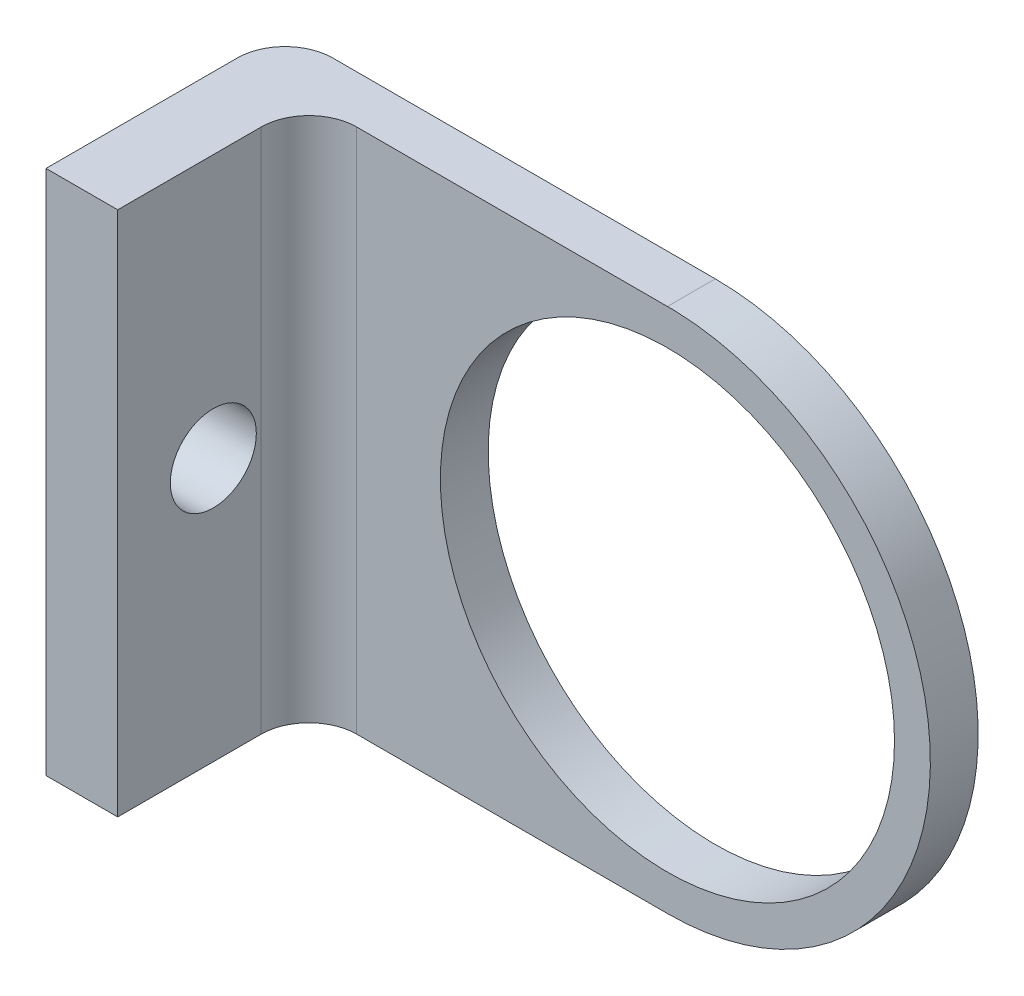
ISO-10303-21;
HEADER;
FILE_DESCRIPTION(('STEP AP214'),'2;1');
FILE_NAME('part.step','',(''),(''),'','','');
FILE_SCHEMA(('AUTOMOTIVE_DESIGN { 1 0 10303 214 1 1 1 1 }'));
ENDSEC;
DATA;
#1=APPLICATION_CONTEXT('core data for automotive mechanical design processes');
#2=APPLICATION_PROTOCOL_DEFINITION('international standard','automotive_design',2000,#1);
#3=PRODUCT_CONTEXT('',#1,'mechanical');
#4=PRODUCT('Part','Part','',(#3));
#5=PRODUCT_RELATED_PRODUCT_CATEGORY('part','',(#4));
#6=PRODUCT_DEFINITION_FORMATION('','',#4);
#7=PRODUCT_DEFINITION_CONTEXT('part definition',#1,'design');
#8=PRODUCT_DEFINITION('design','',#6,#7);
#9=PRODUCT_DEFINITION_SHAPE('','',#8);
#10=(LENGTH_UNIT() NAMED_UNIT(*) SI_UNIT(.MILLI.,.METRE.));
#11=(NAMED_UNIT(*) PLANE_ANGLE_UNIT() SI_UNIT($,.RADIAN.));
#12=(NAMED_UNIT(*) SI_UNIT($,.STERADIAN.) SOLID_ANGLE_UNIT());
#13=UNCERTAINTY_MEASURE_WITH_UNIT(LENGTH_MEASURE(1.E-05),#10,'distance_accuracy_value','');
#14=(GEOMETRIC_REPRESENTATION_CONTEXT(3) GLOBAL_UNCERTAINTY_ASSIGNED_CONTEXT((#13)) GLOBAL_UNIT_ASSIGNED_CONTEXT((#10,
#11,#12)) REPRESENTATION_CONTEXT('',''));
#15=CARTESIAN_POINT('',(0.,0.,0.));
#16=DIRECTION('',(0.,0.,1.));
#17=DIRECTION('',(1.,0.,0.));
#18=AXIS2_PLACEMENT_3D('',#15,#16,#17);
#19=CARTESIAN_POINT('',(0.,0.,10.));
#20=DIRECTION('',(0.,0.,-1.));
#21=DIRECTION('',(-1.,0.,0.));
#22=AXIS2_PLACEMENT_3D('',#19,#20,#21);
#23=CYLINDRICAL_SURFACE('',#22,11.);
#24=CARTESIAN_POINT('',(0.,0.,2.));
#25=DIRECTION('',(0.,0.,1.));
#26=DIRECTION('',(1.,0.,0.));
#27=AXIS2_PLACEMENT_3D('',#24,#25,#26);
#28=CIRCLE('',#27,11.);
#29=CARTESIAN_POINT('',(0.,-11.,2.));
#30=VERTEX_POINT('',#29);
#31=CARTESIAN_POINT('',(0.386602839668812,10.9932041846024,2.));
#32=VERTEX_POINT('',#31);
#33=EDGE_CURVE('E109',#30,#32,#28,.T.);
#34=ORIENTED_EDGE('',*,*,#33,.F.);
#35=DIRECTION('',(0.,0.,-1.));
#36=VECTOR('',#35,1.);
#37=CARTESIAN_POINT('',(0.,-11.,10.));
#38=LINE('',#37,#36);
#39=CARTESIAN_POINT('',(0.,-11.,0.));
#40=VERTEX_POINT('',#39);
#41=EDGE_CURVE('E119',#30,#40,#38,.T.);
#42=ORIENTED_EDGE('',*,*,#41,.T.);
#43=CARTESIAN_POINT('',(0.,0.,0.));
#44=DIRECTION('',(0.,0.,1.));
#45=DIRECTION('',(1.,0.,0.));
#46=AXIS2_PLACEMENT_3D('',#43,#44,#45);
#47=CIRCLE('',#46,11.);
#48=CARTESIAN_POINT('',(0.,11.,0.));
#49=VERTEX_POINT('',#48);
#50=EDGE_CURVE('E216',#40,#49,#47,.T.);
#51=ORIENTED_EDGE('',*,*,#50,.T.);
#52=DIRECTION('',(0.,0.,-1.));
#53=VECTOR('',#52,1.);
#54=CARTESIAN_POINT('',(0.,11.,10.));
#55=LINE('',#54,#53);
#56=CARTESIAN_POINT('',(-3.91820590765716E-06,10.9967174618641,2.));
#57=VERTEX_POINT('',#56);
#58=EDGE_CURVE('E139',#57,#49,#55,.T.);
#59=ORIENTED_EDGE('',*,*,#58,.F.);
#60=CARTESIAN_POINT('',(0.,0.,2.));
#61=DIRECTION('',(0.,0.,-1.));
#62=DIRECTION('',(-3.56413316921096E-07,0.999999999999936,0.));
#63=AXIS2_PLACEMENT_3D('',#60,#61,#62);
#64=CIRCLE('',#63,11.);
#65=EDGE_CURVE('E121',#57,#32,#64,.T.);
#66=ORIENTED_EDGE('',*,*,#65,.T.);
#67=EDGE_LOOP('',(#34,#42,#51,#59,#66));
#68=FACE_BOUND('',#67,.T.);
#69=ADVANCED_FACE('F41',(#68),#23,.T.);
#70=CARTESIAN_POINT('',(0.,11.,10.));
#71=DIRECTION('',(0.,-1.,0.));
#72=DIRECTION('',(0.,0.,-1.));
#73=AXIS2_PLACEMENT_3D('',#70,#71,#72);
#74=PLANE('',#73);
#75=DIRECTION('',(-1.,0.,0.));
#76=VECTOR('',#75,1.);
#77=CARTESIAN_POINT('',(0.,11.,0.));
#78=LINE('',#77,#76);
#79=CARTESIAN_POINT('',(-16.,11.,0.));
#80=VERTEX_POINT('',#79);
#81=EDGE_CURVE('E220',#49,#80,#78,.T.);
#82=ORIENTED_EDGE('',*,*,#81,.T.);
#83=CARTESIAN_POINT('',(-16.,11.,2.));
#84=DIRECTION('',(0.,-1.,0.));
#85=DIRECTION('',(0.,0.,-1.));
#86=AXIS2_PLACEMENT_3D('',#83,#84,#85);
#87=CIRCLE('',#86,2.);
#88=CARTESIAN_POINT('',(-18.,11.,2.));
#89=VERTEX_POINT('',#88);
#90=EDGE_CURVE('E159',#80,#89,#87,.F.);
#91=ORIENTED_EDGE('',*,*,#90,.T.);
#92=DIRECTION('',(0.,0.,-1.));
#93=VECTOR('',#92,1.);
#94=CARTESIAN_POINT('',(-18.,11.,10.));
#95=LINE('',#94,#93);
#96=CARTESIAN_POINT('',(-18.,11.,10.));
#97=VERTEX_POINT('',#96);
#98=EDGE_CURVE('E132',#97,#89,#95,.T.);
#99=ORIENTED_EDGE('',*,*,#98,.F.);
#100=DIRECTION('',(1.,0.,0.));
#101=VECTOR('',#100,1.);
#102=CARTESIAN_POINT('',(0.,11.,10.));
#103=LINE('',#102,#101);
#104=CARTESIAN_POINT('',(-15.,11.,10.));
#105=VERTEX_POINT('',#104);
#106=EDGE_CURVE('E147',#105,#97,#103,.F.);
#107=ORIENTED_EDGE('',*,*,#106,.F.);
#108=DIRECTION('',(0.,0.,1.));
#109=VECTOR('',#108,1.);
#110=CARTESIAN_POINT('',(-15.,11.,2.));
#111=LINE('',#110,#109);
#112=CARTESIAN_POINT('',(-15.,11.,4.));
#113=VERTEX_POINT('',#112);
#114=EDGE_CURVE('E178',#113,#105,#111,.T.);
#115=ORIENTED_EDGE('',*,*,#114,.F.);
#116=CARTESIAN_POINT('',(-13.,11.,4.));
#117=DIRECTION('',(0.,-1.,0.));
#118=DIRECTION('',(0.,0.,-1.));
#119=AXIS2_PLACEMENT_3D('',#116,#117,#118);
#120=CIRCLE('',#119,2.);
#121=CARTESIAN_POINT('',(-13.,11.,2.));
#122=VERTEX_POINT('',#121);
#123=EDGE_CURVE('E11',#113,#122,#120,.T.);
#124=ORIENTED_EDGE('',*,*,#123,.T.);
#125=DIRECTION('',(-1.,0.,0.));
#126=VECTOR('',#125,1.);
#127=CARTESIAN_POINT('',(0.,11.,2.));
#128=LINE('',#127,#126);
#129=EDGE_CURVE('E184',#57,#122,#128,.T.);
#130=ORIENTED_EDGE('',*,*,#129,.F.);
#131=ORIENTED_EDGE('',*,*,#58,.T.);
#132=EDGE_LOOP('',(#82,#91,#99,#107,#115,#124,#130,#131));
#133=FACE_BOUND('',#132,.T.);
#134=ADVANCED_FACE('F181',(#133),#74,.F.);
#135=CARTESIAN_POINT('',(0.,-11.,10.));
#136=DIRECTION('',(0.,-1.,0.));
#137=DIRECTION('',(0.,0.,-1.));
#138=AXIS2_PLACEMENT_3D('',#135,#136,#137);
#139=PLANE('',#138);
#140=DIRECTION('',(0.,0.,-1.));
#141=VECTOR('',#140,1.);
#142=CARTESIAN_POINT('',(-18.,-11.,10.));
#143=LINE('',#142,#141);
#144=CARTESIAN_POINT('',(-18.,-11.,10.));
#145=VERTEX_POINT('',#144);
#146=CARTESIAN_POINT('',(-18.,-11.,2.));
#147=VERTEX_POINT('',#146);
#148=EDGE_CURVE('E129',#145,#147,#143,.T.);
#149=ORIENTED_EDGE('',*,*,#148,.T.);
#150=CARTESIAN_POINT('',(-16.,-11.,2.));
#151=DIRECTION('',(0.,-1.,0.));
#152=DIRECTION('',(0.,0.,-1.));
#153=AXIS2_PLACEMENT_3D('',#150,#151,#152);
#154=CIRCLE('',#153,2.);
#155=CARTESIAN_POINT('',(-16.,-11.,0.));
#156=VERTEX_POINT('',#155);
#157=EDGE_CURVE('E168',#147,#156,#154,.T.);
#158=ORIENTED_EDGE('',*,*,#157,.T.);
#159=DIRECTION('',(-1.,0.,0.));
#160=VECTOR('',#159,1.);
#161=CARTESIAN_POINT('',(0.,-11.,0.));
#162=LINE('',#161,#160);
#163=EDGE_CURVE('E126',#40,#156,#162,.T.);
#164=ORIENTED_EDGE('',*,*,#163,.F.);
#165=ORIENTED_EDGE('',*,*,#41,.F.);
#166=DIRECTION('',(1.,0.,0.));
#167=VECTOR('',#166,1.);
#168=CARTESIAN_POINT('',(0.,-11.,2.));
#169=LINE('',#168,#167);
#170=CARTESIAN_POINT('',(-13.,-11.,2.));
#171=VERTEX_POINT('',#170);
#172=EDGE_CURVE('E104',#171,#30,#169,.T.);
#173=ORIENTED_EDGE('',*,*,#172,.F.);
#174=CARTESIAN_POINT('',(-13.,-11.,4.));
#175=DIRECTION('',(0.,-1.,0.));
#176=DIRECTION('',(0.,0.,-1.));
#177=AXIS2_PLACEMENT_3D('',#174,#175,#176);
#178=CIRCLE('',#177,2.);
#179=CARTESIAN_POINT('',(-15.,-11.,4.));
#180=VERTEX_POINT('',#179);
#181=EDGE_CURVE('E47',#171,#180,#178,.F.);
#182=ORIENTED_EDGE('',*,*,#181,.T.);
#183=DIRECTION('',(0.,0.,1.));
#184=VECTOR('',#183,1.);
#185=CARTESIAN_POINT('',(-15.,-11.,2.));
#186=LINE('',#185,#184);
#187=CARTESIAN_POINT('',(-15.,-11.,10.));
#188=VERTEX_POINT('',#187);
#189=EDGE_CURVE('E179',#180,#188,#186,.T.);
#190=ORIENTED_EDGE('',*,*,#189,.T.);
#191=DIRECTION('',(-1.,0.,0.));
#192=VECTOR('',#191,1.);
#193=CARTESIAN_POINT('',(0.,-11.,10.));
#194=LINE('',#193,#192);
#195=EDGE_CURVE('E128',#188,#145,#194,.T.);
#196=ORIENTED_EDGE('',*,*,#195,.T.);
#197=EDGE_LOOP('',(#149,#158,#164,#165,#173,#182,#190,#196));
#198=FACE_BOUND('',#197,.T.);
#199=ADVANCED_FACE('F127',(#198),#139,.T.);
#200=CARTESIAN_POINT('',(0.,0.,10.));
#201=DIRECTION('',(0.,0.,-1.));
#202=DIRECTION('',(-1.,0.,0.));
#203=AXIS2_PLACEMENT_3D('',#200,#201,#202);
#204=CYLINDRICAL_SURFACE('',#203,9.5);
#205=CARTESIAN_POINT('',(0.,0.,0.));
#206=DIRECTION('',(0.,0.,1.));
#207=DIRECTION('',(1.,0.,0.));
#208=AXIS2_PLACEMENT_3D('',#205,#206,#207);
#209=CIRCLE('',#208,9.5);
#210=CARTESIAN_POINT('',(9.5,0.,0.));
#211=VERTEX_POINT('',#210);
#212=EDGE_CURVE('E222',#211,#211,#209,.T.);
#213=ORIENTED_EDGE('',*,*,#212,.F.);
#214=EDGE_LOOP('',(#213));
#215=FACE_BOUND('',#214,.T.);
#216=CARTESIAN_POINT('',(0.,0.,2.));
#217=DIRECTION('',(0.,0.,1.));
#218=DIRECTION('',(1.,0.,0.));
#219=AXIS2_PLACEMENT_3D('',#216,#217,#218);
#220=CIRCLE('',#219,9.5);
#221=CARTESIAN_POINT('',(9.5,0.,2.));
#222=VERTEX_POINT('',#221);
#223=EDGE_CURVE('E137',#222,#222,#220,.T.);
#224=ORIENTED_EDGE('',*,*,#223,.T.);
#225=EDGE_LOOP('',(#224));
#226=FACE_BOUND('',#225,.T.);
#227=ADVANCED_FACE('F259',(#215,#226),#204,.F.);
#228=CARTESIAN_POINT('',(-18.,0.,10.));
#229=DIRECTION('',(-1.,0.,0.));
#230=DIRECTION('',(0.,0.,1.));
#231=AXIS2_PLACEMENT_3D('',#228,#229,#230);
#232=PLANE('',#231);
#233=CARTESIAN_POINT('',(-18.,-0.00169895384939667,6.));
#234=DIRECTION('',(-1.,0.,0.));
#235=DIRECTION('',(0.,0.,1.));
#236=AXIS2_PLACEMENT_3D('',#233,#234,#235);
#237=CIRCLE('',#236,1.8);
#238=CARTESIAN_POINT('',(-18.,-0.00169895384939667,7.8));
#239=VERTEX_POINT('',#238);
#240=EDGE_CURVE('E233',#239,#239,#237,.T.);
#241=ORIENTED_EDGE('',*,*,#240,.F.);
#242=EDGE_LOOP('',(#241));
#243=FACE_BOUND('',#242,.T.);
#244=ORIENTED_EDGE('',*,*,#98,.T.);
#245=DIRECTION('',(0.,1.,0.));
#246=VECTOR('',#245,1.);
#247=CARTESIAN_POINT('',(-18.,-11.,2.));
#248=LINE('',#247,#246);
#249=EDGE_CURVE('E163',#89,#147,#248,.F.);
#250=ORIENTED_EDGE('',*,*,#249,.T.);
#251=ORIENTED_EDGE('',*,*,#148,.F.);
#252=DIRECTION('',(0.,1.,0.));
#253=VECTOR('',#252,1.);
#254=CARTESIAN_POINT('',(-18.,0.,10.));
#255=LINE('',#254,#253);
#256=EDGE_CURVE('E133',#145,#97,#255,.T.);
#257=ORIENTED_EDGE('',*,*,#256,.T.);
#258=EDGE_LOOP('',(#244,#250,#251,#257));
#259=FACE_BOUND('',#258,.T.);
#260=ADVANCED_FACE('F230',(#243,#259),#232,.T.);
#261=CARTESIAN_POINT('',(0.,0.,10.));
#262=DIRECTION('',(0.,0.,1.));
#263=DIRECTION('',(1.,0.,0.));
#264=AXIS2_PLACEMENT_3D('',#261,#262,#263);
#265=PLANE('',#264);
#266=DIRECTION('',(0.,-1.,0.));
#267=VECTOR('',#266,1.);
#268=CARTESIAN_POINT('',(-15.,0.,10.));
#269=LINE('',#268,#267);
#270=EDGE_CURVE('E111',#105,#188,#269,.T.);
#271=ORIENTED_EDGE('',*,*,#270,.F.);
#272=ORIENTED_EDGE('',*,*,#106,.T.);
#273=ORIENTED_EDGE('',*,*,#256,.F.);
#274=ORIENTED_EDGE('',*,*,#195,.F.);
#275=EDGE_LOOP('',(#271,#272,#273,#274));
#276=FACE_BOUND('',#275,.T.);
#277=ADVANCED_FACE('F227',(#276),#265,.T.);
#278=CARTESIAN_POINT('',(0.,0.,0.));
#279=DIRECTION('',(0.,0.,1.));
#280=DIRECTION('',(1.,0.,0.));
#281=AXIS2_PLACEMENT_3D('',#278,#279,#280);
#282=PLANE('',#281);
#283=ORIENTED_EDGE('',*,*,#163,.T.);
#284=DIRECTION('',(0.,1.,0.));
#285=VECTOR('',#284,1.);
#286=CARTESIAN_POINT('',(-16.,11.,0.));
#287=LINE('',#286,#285);
#288=EDGE_CURVE('E154',#156,#80,#287,.T.);
#289=ORIENTED_EDGE('',*,*,#288,.T.);
#290=ORIENTED_EDGE('',*,*,#81,.F.);
#291=ORIENTED_EDGE('',*,*,#50,.F.);
#292=EDGE_LOOP('',(#283,#289,#290,#291));
#293=FACE_BOUND('',#292,.T.);
#294=ORIENTED_EDGE('',*,*,#212,.T.);
#295=EDGE_LOOP('',(#294));
#296=FACE_BOUND('',#295,.T.);
#297=ADVANCED_FACE('F251',(#293,#296),#282,.F.);
#298=CARTESIAN_POINT('',(-15.,0.,2.));
#299=DIRECTION('',(-1.,0.,0.));
#300=DIRECTION('',(0.,0.,1.));
#301=AXIS2_PLACEMENT_3D('',#298,#299,#300);
#302=PLANE('',#301);
#303=CARTESIAN_POINT('',(-15.,-0.00169895384939667,6.));
#304=DIRECTION('',(1.,0.,0.));
#305=DIRECTION('',(0.,0.,-1.));
#306=AXIS2_PLACEMENT_3D('',#303,#304,#305);
#307=CIRCLE('',#306,1.8);
#308=CARTESIAN_POINT('',(-15.,-0.00169895384939667,4.2));
#309=VERTEX_POINT('',#308);
#310=EDGE_CURVE('E237',#309,#309,#307,.T.);
#311=ORIENTED_EDGE('',*,*,#310,.F.);
#312=EDGE_LOOP('',(#311));
#313=FACE_BOUND('',#312,.T.);
#314=ORIENTED_EDGE('',*,*,#189,.F.);
#315=DIRECTION('',(0.,-1.,0.));
#316=VECTOR('',#315,1.);
#317=CARTESIAN_POINT('',(-15.,0.,4.));
#318=LINE('',#317,#316);
#319=EDGE_CURVE('E174',#180,#113,#318,.F.);
#320=ORIENTED_EDGE('',*,*,#319,.T.);
#321=ORIENTED_EDGE('',*,*,#114,.T.);
#322=ORIENTED_EDGE('',*,*,#270,.T.);
#323=EDGE_LOOP('',(#314,#320,#321,#322));
#324=FACE_BOUND('',#323,.T.);
#325=ADVANCED_FACE('F176',(#313,#324),#302,.F.);
#326=CARTESIAN_POINT('',(0.,0.,2.));
#327=DIRECTION('',(0.,0.,1.));
#328=DIRECTION('',(1.,0.,0.));
#329=AXIS2_PLACEMENT_3D('',#326,#327,#328);
#330=PLANE('',#329);
#331=ORIENTED_EDGE('',*,*,#223,.F.);
#332=EDGE_LOOP('',(#331));
#333=FACE_BOUND('',#332,.T.);
#334=ORIENTED_EDGE('',*,*,#129,.T.);
#335=DIRECTION('',(0.,-1.,0.));
#336=VECTOR('',#335,1.);
#337=CARTESIAN_POINT('',(-13.,0.,2.));
#338=LINE('',#337,#336);
#339=EDGE_CURVE('E115',#122,#171,#338,.T.);
#340=ORIENTED_EDGE('',*,*,#339,.T.);
#341=ORIENTED_EDGE('',*,*,#172,.T.);
#342=ORIENTED_EDGE('',*,*,#33,.T.);
#343=ORIENTED_EDGE('',*,*,#65,.F.);
#344=EDGE_LOOP('',(#334,#340,#341,#342,#343));
#345=FACE_BOUND('',#344,.T.);
#346=ADVANCED_FACE('F107',(#333,#345),#330,.T.);
#347=CARTESIAN_POINT('',(-23.,-0.00169895384939667,6.));
#348=DIRECTION('',(1.,0.,0.));
#349=DIRECTION('',(0.,0.,-1.));
#350=AXIS2_PLACEMENT_3D('',#347,#348,#349);
#351=CYLINDRICAL_SURFACE('',#350,1.8);
#352=ORIENTED_EDGE('',*,*,#240,.T.);
#353=EDGE_LOOP('',(#352));
#354=FACE_BOUND('',#353,.T.);
#355=ORIENTED_EDGE('',*,*,#310,.T.);
#356=EDGE_LOOP('',(#355));
#357=FACE_BOUND('',#356,.T.);
#358=ADVANCED_FACE('F191',(#354,#357),#351,.F.);
#359=CARTESIAN_POINT('',(-16.,0.,2.));
#360=DIRECTION('',(0.,-1.,0.));
#361=DIRECTION('',(0.,0.,-1.));
#362=AXIS2_PLACEMENT_3D('',#359,#360,#361);
#363=CYLINDRICAL_SURFACE('',#362,2.);
#364=ORIENTED_EDGE('',*,*,#157,.F.);
#365=ORIENTED_EDGE('',*,*,#249,.F.);
#366=ORIENTED_EDGE('',*,*,#90,.F.);
#367=ORIENTED_EDGE('',*,*,#288,.F.);
#368=EDGE_LOOP('',(#364,#365,#366,#367));
#369=FACE_BOUND('',#368,.T.);
#370=ADVANCED_FACE('F187',(#369),#363,.T.);
#371=CARTESIAN_POINT('',(-13.,0.,4.));
#372=DIRECTION('',(0.,-1.,0.));
#373=DIRECTION('',(0.,0.,-1.));
#374=AXIS2_PLACEMENT_3D('',#371,#372,#373);
#375=CYLINDRICAL_SURFACE('',#374,2.);
#376=ORIENTED_EDGE('',*,*,#123,.F.);
#377=ORIENTED_EDGE('',*,*,#319,.F.);
#378=ORIENTED_EDGE('',*,*,#181,.F.);
#379=ORIENTED_EDGE('',*,*,#339,.F.);
#380=EDGE_LOOP('',(#376,#377,#378,#379));
#381=FACE_BOUND('',#380,.T.);
#382=ADVANCED_FACE('F43',(#381),#375,.F.);
#383=CLOSED_SHELL('',(#69,#134,#199,#227,#260,#277,#297,#325,#346,#358,#370,#382));
#384=MANIFOLD_SOLID_BREP('B2',#383);
#385=ADVANCED_BREP_SHAPE_REPRESENTATION('',(#18,#384),#14);
#386=SHAPE_DEFINITION_REPRESENTATION(#9,#385);
ENDSEC;
END-ISO-10303-21;
